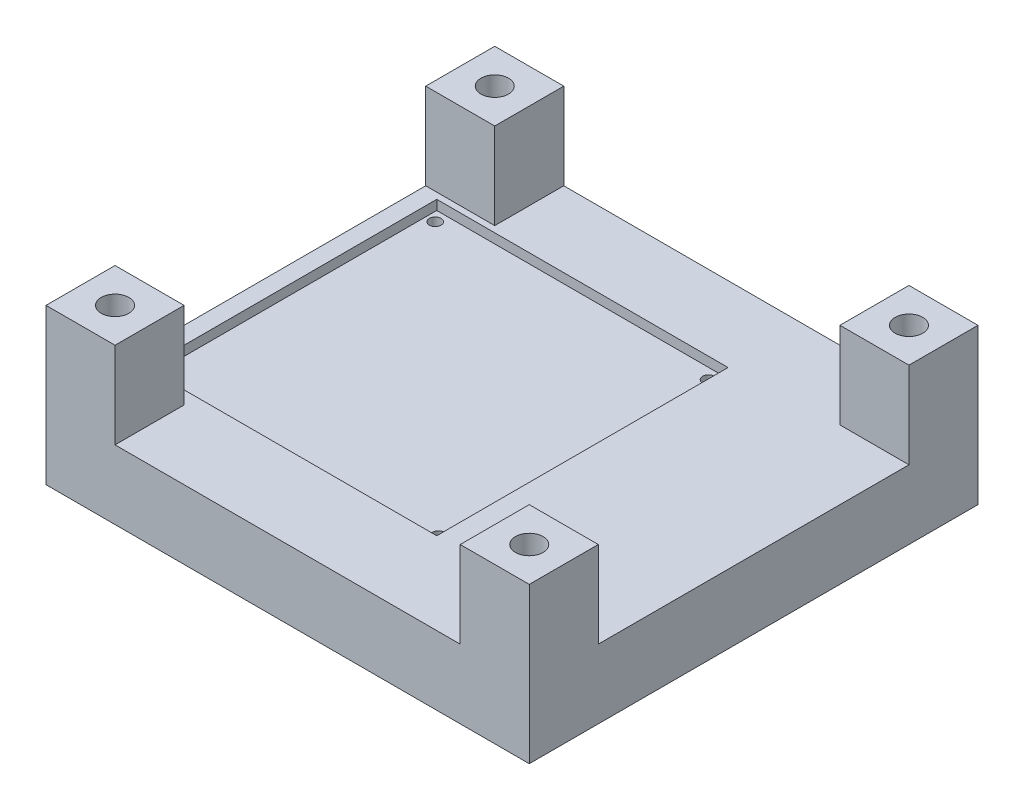
ISO-10303-21;
HEADER;
FILE_DESCRIPTION(('STEP AP214'),'2;1');
FILE_NAME('part.step','',(''),(''),'','','');
FILE_SCHEMA(('AUTOMOTIVE_DESIGN { 1 0 10303 214 1 1 1 1 }'));
ENDSEC;
DATA;
#1=APPLICATION_CONTEXT('core data for automotive mechanical design processes');
#2=APPLICATION_PROTOCOL_DEFINITION('international standard','automotive_design',2000,#1);
#3=PRODUCT_CONTEXT('',#1,'mechanical');
#4=PRODUCT('Part','Part','',(#3));
#5=PRODUCT_RELATED_PRODUCT_CATEGORY('part','',(#4));
#6=PRODUCT_DEFINITION_FORMATION('','',#4);
#7=PRODUCT_DEFINITION_CONTEXT('part definition',#1,'design');
#8=PRODUCT_DEFINITION('design','',#6,#7);
#9=PRODUCT_DEFINITION_SHAPE('','',#8);
#10=(LENGTH_UNIT() NAMED_UNIT(*) SI_UNIT(.MILLI.,.METRE.));
#11=(NAMED_UNIT(*) PLANE_ANGLE_UNIT() SI_UNIT($,.RADIAN.));
#12=(NAMED_UNIT(*) SI_UNIT($,.STERADIAN.) SOLID_ANGLE_UNIT());
#13=UNCERTAINTY_MEASURE_WITH_UNIT(LENGTH_MEASURE(1.E-05),#10,'distance_accuracy_value','');
#14=(GEOMETRIC_REPRESENTATION_CONTEXT(3) GLOBAL_UNCERTAINTY_ASSIGNED_CONTEXT((#13)) GLOBAL_UNIT_ASSIGNED_CONTEXT((#10,
#11,#12)) REPRESENTATION_CONTEXT('',''));
#15=CARTESIAN_POINT('',(0.,0.,0.));
#16=DIRECTION('',(0.,0.,1.));
#17=DIRECTION('',(1.,0.,0.));
#18=AXIS2_PLACEMENT_3D('',#15,#16,#17);
#19=CARTESIAN_POINT('',(0.,25.4,0.));
#20=DIRECTION('',(0.,1.,0.));
#21=DIRECTION('',(0.,0.,1.));
#22=AXIS2_PLACEMENT_3D('',#19,#20,#21);
#23=PLANE('',#22);
#24=DIRECTION('',(0.,0.,1.));
#25=VECTOR('',#24,1.);
#26=CARTESIAN_POINT('',(6.35,25.4,27.6829831364658));
#27=LINE('',#26,#25);
#28=CARTESIAN_POINT('',(6.35,25.4,27.6829831364658));
#29=VERTEX_POINT('',#28);
#30=CARTESIAN_POINT('',(6.35000000000001,25.4,134.870983136466));
#31=VERTEX_POINT('',#30);
#32=EDGE_CURVE('E54',#29,#31,#27,.T.);
#33=ORIENTED_EDGE('',*,*,#32,.F.);
#34=DIRECTION('',(-1.,0.,0.));
#35=VECTOR('',#34,1.);
#36=CARTESIAN_POINT('',(6.35,25.4,27.6829831364658));
#37=LINE('',#36,#35);
#38=CARTESIAN_POINT('',(113.538,25.4,27.6829831364658));
#39=VERTEX_POINT('',#38);
#40=EDGE_CURVE('E197',#39,#29,#37,.T.);
#41=ORIENTED_EDGE('',*,*,#40,.F.);
#42=DIRECTION('',(0.,0.,-1.));
#43=VECTOR('',#42,1.);
#44=CARTESIAN_POINT('',(113.538,25.4,27.6829831364658));
#45=LINE('',#44,#43);
#46=CARTESIAN_POINT('',(113.538,25.4,134.870983136466));
#47=VERTEX_POINT('',#46);
#48=EDGE_CURVE('E200',#47,#39,#45,.T.);
#49=ORIENTED_EDGE('',*,*,#48,.F.);
#50=DIRECTION('',(1.,0.,0.));
#51=VECTOR('',#50,1.);
#52=CARTESIAN_POINT('',(6.35000000000001,25.4,134.870983136466));
#53=LINE('',#52,#51);
#54=EDGE_CURVE('E209',#31,#47,#53,.T.);
#55=ORIENTED_EDGE('',*,*,#54,.F.);
#56=EDGE_LOOP('',(#33,#41,#49,#55));
#57=FACE_BOUND('',#56,.T.);
#58=DIRECTION('',(0.,0.,-1.));
#59=VECTOR('',#58,1.);
#60=CARTESIAN_POINT('',(152.4,25.4,0.));
#61=LINE('',#60,#59);
#62=CARTESIAN_POINT('',(152.4,25.4,25.4));
#63=VERTEX_POINT('',#62);
#64=CARTESIAN_POINT('',(152.4,25.4,0.));
#65=VERTEX_POINT('',#64);
#66=EDGE_CURVE('E216',#63,#65,#61,.T.);
#67=ORIENTED_EDGE('',*,*,#66,.T.);
#68=DIRECTION('',(-1.,0.,0.));
#69=VECTOR('',#68,1.);
#70=CARTESIAN_POINT('',(0.,25.4,0.));
#71=LINE('',#70,#69);
#72=CARTESIAN_POINT('',(25.4,25.4,0.));
#73=VERTEX_POINT('',#72);
#74=EDGE_CURVE('E325',#65,#73,#71,.T.);
#75=ORIENTED_EDGE('',*,*,#74,.T.);
#76=DIRECTION('',(0.,0.,-1.));
#77=VECTOR('',#76,1.);
#78=CARTESIAN_POINT('',(25.4,25.4,0.));
#79=LINE('',#78,#77);
#80=CARTESIAN_POINT('',(25.4,25.4,25.4));
#81=VERTEX_POINT('',#80);
#82=EDGE_CURVE('E297',#81,#73,#79,.T.);
#83=ORIENTED_EDGE('',*,*,#82,.F.);
#84=DIRECTION('',(1.,0.,0.));
#85=VECTOR('',#84,1.);
#86=CARTESIAN_POINT('',(0.,25.4,25.4));
#87=LINE('',#86,#85);
#88=CARTESIAN_POINT('',(0.,25.4,25.4));
#89=VERTEX_POINT('',#88);
#90=EDGE_CURVE('E292',#89,#81,#87,.T.);
#91=ORIENTED_EDGE('',*,*,#90,.F.);
#92=DIRECTION('',(0.,0.,1.));
#93=VECTOR('',#92,1.);
#94=CARTESIAN_POINT('',(0.,25.4,0.));
#95=LINE('',#94,#93);
#96=CARTESIAN_POINT('',(0.,25.4,139.7));
#97=VERTEX_POINT('',#96);
#98=EDGE_CURVE('E318',#89,#97,#95,.T.);
#99=ORIENTED_EDGE('',*,*,#98,.T.);
#100=DIRECTION('',(1.,0.,0.));
#101=VECTOR('',#100,1.);
#102=CARTESIAN_POINT('',(0.,25.4,139.7));
#103=LINE('',#102,#101);
#104=CARTESIAN_POINT('',(25.4,25.4,139.7));
#105=VERTEX_POINT('',#104);
#106=EDGE_CURVE('E272',#97,#105,#103,.T.);
#107=ORIENTED_EDGE('',*,*,#106,.T.);
#108=DIRECTION('',(0.,0.,1.));
#109=VECTOR('',#108,1.);
#110=CARTESIAN_POINT('',(25.4,25.4,165.1));
#111=LINE('',#110,#109);
#112=CARTESIAN_POINT('',(25.4,25.4,165.1));
#113=VERTEX_POINT('',#112);
#114=EDGE_CURVE('E267',#105,#113,#111,.T.);
#115=ORIENTED_EDGE('',*,*,#114,.T.);
#116=DIRECTION('',(1.,0.,0.));
#117=VECTOR('',#116,1.);
#118=CARTESIAN_POINT('',(0.,25.4,165.1));
#119=LINE('',#118,#117);
#120=CARTESIAN_POINT('',(152.4,25.4,165.1));
#121=VERTEX_POINT('',#120);
#122=EDGE_CURVE('E320',#113,#121,#119,.T.);
#123=ORIENTED_EDGE('',*,*,#122,.T.);
#124=DIRECTION('',(0.,0.,1.));
#125=VECTOR('',#124,1.);
#126=CARTESIAN_POINT('',(152.4,25.4,165.1));
#127=LINE('',#126,#125);
#128=CARTESIAN_POINT('',(152.4,25.4,139.7));
#129=VERTEX_POINT('',#128);
#130=EDGE_CURVE('E247',#129,#121,#127,.T.);
#131=ORIENTED_EDGE('',*,*,#130,.F.);
#132=DIRECTION('',(-1.,0.,0.));
#133=VECTOR('',#132,1.);
#134=CARTESIAN_POINT('',(177.8,25.4,139.7));
#135=LINE('',#134,#133);
#136=CARTESIAN_POINT('',(177.8,25.4,139.7));
#137=VERTEX_POINT('',#136);
#138=EDGE_CURVE('E242',#137,#129,#135,.T.);
#139=ORIENTED_EDGE('',*,*,#138,.F.);
#140=DIRECTION('',(0.,0.,-1.));
#141=VECTOR('',#140,1.);
#142=CARTESIAN_POINT('',(177.8,25.4,0.));
#143=LINE('',#142,#141);
#144=CARTESIAN_POINT('',(177.8,25.4,25.4));
#145=VERTEX_POINT('',#144);
#146=EDGE_CURVE('E323',#137,#145,#143,.T.);
#147=ORIENTED_EDGE('',*,*,#146,.T.);
#148=DIRECTION('',(-1.,0.,0.));
#149=VECTOR('',#148,1.);
#150=CARTESIAN_POINT('',(177.8,25.4,25.4));
#151=LINE('',#150,#149);
#152=EDGE_CURVE('E62',#145,#63,#151,.T.);
#153=ORIENTED_EDGE('',*,*,#152,.T.);
#154=EDGE_LOOP('',(#67,#75,#83,#91,#99,#107,#115,#123,#131,#139,#147,#153));
#155=FACE_BOUND('',#154,.T.);
#156=ADVANCED_FACE('F39',(#57,#155),#23,.T.);
#157=CARTESIAN_POINT('',(0.,25.4,0.));
#158=DIRECTION('',(1.,0.,0.));
#159=DIRECTION('',(0.,0.,-1.));
#160=AXIS2_PLACEMENT_3D('',#157,#158,#159);
#161=PLANE('',#160);
#162=DIRECTION('',(0.,0.,1.));
#163=VECTOR('',#162,1.);
#164=CARTESIAN_POINT('',(0.,0.,0.));
#165=LINE('',#164,#163);
#166=CARTESIAN_POINT('',(0.,0.,0.));
#167=VERTEX_POINT('',#166);
#168=CARTESIAN_POINT('',(0.,0.,165.1));
#169=VERTEX_POINT('',#168);
#170=EDGE_CURVE('E317',#167,#169,#165,.T.);
#171=ORIENTED_EDGE('',*,*,#170,.T.);
#172=DIRECTION('',(0.,-1.,0.));
#173=VECTOR('',#172,1.);
#174=CARTESIAN_POINT('',(0.,25.4,165.1));
#175=LINE('',#174,#173);
#176=CARTESIAN_POINT('',(0.,57.15,165.1));
#177=VERTEX_POINT('',#176);
#178=EDGE_CURVE('E11',#177,#169,#175,.T.);
#179=ORIENTED_EDGE('',*,*,#178,.F.);
#180=DIRECTION('',(0.,0.,-1.));
#181=VECTOR('',#180,1.);
#182=CARTESIAN_POINT('',(0.,57.15,165.1));
#183=LINE('',#182,#181);
#184=CARTESIAN_POINT('',(0.,57.15,139.7));
#185=VERTEX_POINT('',#184);
#186=EDGE_CURVE('E268',#177,#185,#183,.T.);
#187=ORIENTED_EDGE('',*,*,#186,.T.);
#188=DIRECTION('',(0.,-1.,0.));
#189=VECTOR('',#188,1.);
#190=CARTESIAN_POINT('',(0.,57.15,139.7));
#191=LINE('',#190,#189);
#192=EDGE_CURVE('E281',#185,#97,#191,.T.);
#193=ORIENTED_EDGE('',*,*,#192,.T.);
#194=ORIENTED_EDGE('',*,*,#98,.F.);
#195=DIRECTION('',(0.,-1.,0.));
#196=VECTOR('',#195,1.);
#197=CARTESIAN_POINT('',(0.,57.15,25.4));
#198=LINE('',#197,#196);
#199=CARTESIAN_POINT('',(0.,57.15,25.4));
#200=VERTEX_POINT('',#199);
#201=EDGE_CURVE('E314',#200,#89,#198,.T.);
#202=ORIENTED_EDGE('',*,*,#201,.F.);
#203=DIRECTION('',(0.,0.,1.));
#204=VECTOR('',#203,1.);
#205=CARTESIAN_POINT('',(0.,57.15,0.));
#206=LINE('',#205,#204);
#207=CARTESIAN_POINT('',(0.,57.15,0.));
#208=VERTEX_POINT('',#207);
#209=EDGE_CURVE('E293',#208,#200,#206,.T.);
#210=ORIENTED_EDGE('',*,*,#209,.F.);
#211=DIRECTION('',(0.,-1.,0.));
#212=VECTOR('',#211,1.);
#213=CARTESIAN_POINT('',(0.,25.4,0.));
#214=LINE('',#213,#212);
#215=EDGE_CURVE('E327',#208,#167,#214,.T.);
#216=ORIENTED_EDGE('',*,*,#215,.T.);
#217=EDGE_LOOP('',(#171,#179,#187,#193,#194,#202,#210,#216));
#218=FACE_BOUND('',#217,.T.);
#219=ADVANCED_FACE('F41',(#218),#161,.F.);
#220=CARTESIAN_POINT('',(0.,25.4,165.1));
#221=DIRECTION('',(0.,0.,-1.));
#222=DIRECTION('',(-1.,0.,0.));
#223=AXIS2_PLACEMENT_3D('',#220,#221,#222);
#224=PLANE('',#223);
#225=DIRECTION('',(1.,0.,0.));
#226=VECTOR('',#225,1.);
#227=CARTESIAN_POINT('',(0.,0.,165.1));
#228=LINE('',#227,#226);
#229=CARTESIAN_POINT('',(177.8,0.,165.1));
#230=VERTEX_POINT('',#229);
#231=EDGE_CURVE('E330',#169,#230,#228,.T.);
#232=ORIENTED_EDGE('',*,*,#231,.T.);
#233=DIRECTION('',(0.,-1.,0.));
#234=VECTOR('',#233,1.);
#235=CARTESIAN_POINT('',(177.8,25.4,165.1));
#236=LINE('',#235,#234);
#237=CARTESIAN_POINT('',(177.8,57.15,165.1));
#238=VERTEX_POINT('',#237);
#239=EDGE_CURVE('E47',#238,#230,#236,.T.);
#240=ORIENTED_EDGE('',*,*,#239,.F.);
#241=DIRECTION('',(1.,0.,0.));
#242=VECTOR('',#241,1.);
#243=CARTESIAN_POINT('',(177.8,57.15,165.1));
#244=LINE('',#243,#242);
#245=CARTESIAN_POINT('',(152.4,57.15,165.1));
#246=VERTEX_POINT('',#245);
#247=EDGE_CURVE('E251',#246,#238,#244,.T.);
#248=ORIENTED_EDGE('',*,*,#247,.F.);
#249=DIRECTION('',(0.,-1.,0.));
#250=VECTOR('',#249,1.);
#251=CARTESIAN_POINT('',(152.4,57.15,165.1));
#252=LINE('',#251,#250);
#253=EDGE_CURVE('E254',#246,#121,#252,.T.);
#254=ORIENTED_EDGE('',*,*,#253,.T.);
#255=ORIENTED_EDGE('',*,*,#122,.F.);
#256=DIRECTION('',(0.,-1.,0.));
#257=VECTOR('',#256,1.);
#258=CARTESIAN_POINT('',(25.4,57.15,165.1));
#259=LINE('',#258,#257);
#260=CARTESIAN_POINT('',(25.4,57.15,165.1));
#261=VERTEX_POINT('',#260);
#262=EDGE_CURVE('E289',#261,#113,#259,.T.);
#263=ORIENTED_EDGE('',*,*,#262,.F.);
#264=DIRECTION('',(-1.,0.,0.));
#265=VECTOR('',#264,1.);
#266=CARTESIAN_POINT('',(0.,57.15,165.1));
#267=LINE('',#266,#265);
#268=EDGE_CURVE('E271',#261,#177,#267,.T.);
#269=ORIENTED_EDGE('',*,*,#268,.T.);
#270=ORIENTED_EDGE('',*,*,#178,.T.);
#271=EDGE_LOOP('',(#232,#240,#248,#254,#255,#263,#269,#270));
#272=FACE_BOUND('',#271,.T.);
#273=ADVANCED_FACE('F383',(#272),#224,.F.);
#274=CARTESIAN_POINT('',(177.8,25.4,0.));
#275=DIRECTION('',(-1.,0.,0.));
#276=DIRECTION('',(0.,0.,1.));
#277=AXIS2_PLACEMENT_3D('',#274,#275,#276);
#278=PLANE('',#277);
#279=DIRECTION('',(0.,0.,-1.));
#280=VECTOR('',#279,1.);
#281=CARTESIAN_POINT('',(177.8,0.,0.));
#282=LINE('',#281,#280);
#283=CARTESIAN_POINT('',(177.8,0.,0.));
#284=VERTEX_POINT('',#283);
#285=EDGE_CURVE('E332',#230,#284,#282,.T.);
#286=ORIENTED_EDGE('',*,*,#285,.T.);
#287=DIRECTION('',(0.,-1.,0.));
#288=VECTOR('',#287,1.);
#289=CARTESIAN_POINT('',(177.8,25.4,0.));
#290=LINE('',#289,#288);
#291=CARTESIAN_POINT('',(177.8,57.15,0.));
#292=VERTEX_POINT('',#291);
#293=EDGE_CURVE('E337',#292,#284,#290,.T.);
#294=ORIENTED_EDGE('',*,*,#293,.F.);
#295=DIRECTION('',(0.,0.,1.));
#296=VECTOR('',#295,1.);
#297=CARTESIAN_POINT('',(177.8,57.15,0.));
#298=LINE('',#297,#296);
#299=CARTESIAN_POINT('',(177.8,57.15,25.4));
#300=VERTEX_POINT('',#299);
#301=EDGE_CURVE('E220',#292,#300,#298,.T.);
#302=ORIENTED_EDGE('',*,*,#301,.T.);
#303=DIRECTION('',(0.,-1.,0.));
#304=VECTOR('',#303,1.);
#305=CARTESIAN_POINT('',(177.8,57.15,25.4));
#306=LINE('',#305,#304);
#307=EDGE_CURVE('E232',#300,#145,#306,.T.);
#308=ORIENTED_EDGE('',*,*,#307,.T.);
#309=ORIENTED_EDGE('',*,*,#146,.F.);
#310=DIRECTION('',(0.,-1.,0.));
#311=VECTOR('',#310,1.);
#312=CARTESIAN_POINT('',(177.8,57.15,139.7));
#313=LINE('',#312,#311);
#314=CARTESIAN_POINT('',(177.8,57.15,139.7));
#315=VERTEX_POINT('',#314);
#316=EDGE_CURVE('E264',#315,#137,#313,.T.);
#317=ORIENTED_EDGE('',*,*,#316,.F.);
#318=DIRECTION('',(0.,0.,-1.));
#319=VECTOR('',#318,1.);
#320=CARTESIAN_POINT('',(177.8,57.15,165.1));
#321=LINE('',#320,#319);
#322=EDGE_CURVE('E243',#238,#315,#321,.T.);
#323=ORIENTED_EDGE('',*,*,#322,.F.);
#324=ORIENTED_EDGE('',*,*,#239,.T.);
#325=EDGE_LOOP('',(#286,#294,#302,#308,#309,#317,#323,#324));
#326=FACE_BOUND('',#325,.T.);
#327=ADVANCED_FACE('F343',(#326),#278,.F.);
#328=CARTESIAN_POINT('',(0.,25.4,0.));
#329=DIRECTION('',(0.,0.,1.));
#330=DIRECTION('',(1.,0.,0.));
#331=AXIS2_PLACEMENT_3D('',#328,#329,#330);
#332=PLANE('',#331);
#333=DIRECTION('',(-1.,0.,0.));
#334=VECTOR('',#333,1.);
#335=CARTESIAN_POINT('',(0.,0.,0.));
#336=LINE('',#335,#334);
#337=EDGE_CURVE('E321',#284,#167,#336,.T.);
#338=ORIENTED_EDGE('',*,*,#337,.T.);
#339=ORIENTED_EDGE('',*,*,#215,.F.);
#340=DIRECTION('',(-1.,0.,0.));
#341=VECTOR('',#340,1.);
#342=CARTESIAN_POINT('',(0.,57.15,0.));
#343=LINE('',#342,#341);
#344=CARTESIAN_POINT('',(25.4,57.15,0.));
#345=VERTEX_POINT('',#344);
#346=EDGE_CURVE('E301',#345,#208,#343,.T.);
#347=ORIENTED_EDGE('',*,*,#346,.F.);
#348=DIRECTION('',(0.,-1.,0.));
#349=VECTOR('',#348,1.);
#350=CARTESIAN_POINT('',(25.4,57.15,0.));
#351=LINE('',#350,#349);
#352=EDGE_CURVE('E304',#345,#73,#351,.T.);
#353=ORIENTED_EDGE('',*,*,#352,.T.);
#354=ORIENTED_EDGE('',*,*,#74,.F.);
#355=DIRECTION('',(0.,-1.,0.));
#356=VECTOR('',#355,1.);
#357=CARTESIAN_POINT('',(152.4,57.15,0.));
#358=LINE('',#357,#356);
#359=CARTESIAN_POINT('',(152.4,57.15,0.));
#360=VERTEX_POINT('',#359);
#361=EDGE_CURVE('E239',#360,#65,#358,.T.);
#362=ORIENTED_EDGE('',*,*,#361,.F.);
#363=DIRECTION('',(1.,0.,0.));
#364=VECTOR('',#363,1.);
#365=CARTESIAN_POINT('',(177.8,57.15,0.));
#366=LINE('',#365,#364);
#367=EDGE_CURVE('E223',#360,#292,#366,.T.);
#368=ORIENTED_EDGE('',*,*,#367,.T.);
#369=ORIENTED_EDGE('',*,*,#293,.T.);
#370=EDGE_LOOP('',(#338,#339,#347,#353,#354,#362,#368,#369));
#371=FACE_BOUND('',#370,.T.);
#372=ADVANCED_FACE('F352',(#371),#332,.F.);
#373=CARTESIAN_POINT('',(0.,0.,0.));
#374=DIRECTION('',(0.,1.,0.));
#375=DIRECTION('',(0.,0.,1.));
#376=AXIS2_PLACEMENT_3D('',#373,#374,#375);
#377=PLANE('',#376);
#378=ORIENTED_EDGE('',*,*,#170,.F.);
#379=ORIENTED_EDGE('',*,*,#337,.F.);
#380=ORIENTED_EDGE('',*,*,#285,.F.);
#381=ORIENTED_EDGE('',*,*,#231,.F.);
#382=EDGE_LOOP('',(#378,#379,#380,#381));
#383=FACE_BOUND('',#382,.T.);
#384=ADVANCED_FACE('F350',(#383),#377,.F.);
#385=CARTESIAN_POINT('',(0.,57.15,25.4));
#386=DIRECTION('',(0.,0.,-1.));
#387=DIRECTION('',(-1.,0.,0.));
#388=AXIS2_PLACEMENT_3D('',#385,#386,#387);
#389=PLANE('',#388);
#390=ORIENTED_EDGE('',*,*,#90,.T.);
#391=DIRECTION('',(0.,-1.,0.));
#392=VECTOR('',#391,1.);
#393=CARTESIAN_POINT('',(25.4,57.15,25.4));
#394=LINE('',#393,#392);
#395=CARTESIAN_POINT('',(25.4,57.15,25.4));
#396=VERTEX_POINT('',#395);
#397=EDGE_CURVE('E311',#396,#81,#394,.T.);
#398=ORIENTED_EDGE('',*,*,#397,.F.);
#399=DIRECTION('',(1.,0.,0.));
#400=VECTOR('',#399,1.);
#401=CARTESIAN_POINT('',(0.,57.15,25.4));
#402=LINE('',#401,#400);
#403=EDGE_CURVE('E296',#200,#396,#402,.T.);
#404=ORIENTED_EDGE('',*,*,#403,.F.);
#405=ORIENTED_EDGE('',*,*,#201,.T.);
#406=EDGE_LOOP('',(#390,#398,#404,#405));
#407=FACE_BOUND('',#406,.T.);
#408=ADVANCED_FACE('F366',(#407),#389,.F.);
#409=CARTESIAN_POINT('',(25.4,57.15,0.));
#410=DIRECTION('',(-1.,0.,0.));
#411=DIRECTION('',(0.,0.,1.));
#412=AXIS2_PLACEMENT_3D('',#409,#410,#411);
#413=PLANE('',#412);
#414=ORIENTED_EDGE('',*,*,#82,.T.);
#415=ORIENTED_EDGE('',*,*,#352,.F.);
#416=DIRECTION('',(0.,0.,-1.));
#417=VECTOR('',#416,1.);
#418=CARTESIAN_POINT('',(25.4,57.15,0.));
#419=LINE('',#418,#417);
#420=EDGE_CURVE('E299',#396,#345,#419,.T.);
#421=ORIENTED_EDGE('',*,*,#420,.F.);
#422=ORIENTED_EDGE('',*,*,#397,.T.);
#423=EDGE_LOOP('',(#414,#415,#421,#422));
#424=FACE_BOUND('',#423,.T.);
#425=ADVANCED_FACE('F364',(#424),#413,.F.);
#426=CARTESIAN_POINT('',(0.,57.15,0.));
#427=DIRECTION('',(0.,1.,0.));
#428=DIRECTION('',(0.,0.,1.));
#429=AXIS2_PLACEMENT_3D('',#426,#427,#428);
#430=PLANE('',#429);
#431=CARTESIAN_POINT('',(12.7,57.15,12.7));
#432=DIRECTION('',(0.,1.,0.));
#433=DIRECTION('',(0.,0.,1.));
#434=AXIS2_PLACEMENT_3D('',#431,#432,#433);
#435=CIRCLE('',#434,5.08);
#436=CARTESIAN_POINT('',(12.7,57.15,17.78));
#437=VERTEX_POINT('',#436);
#438=EDGE_CURVE('E499',#437,#437,#435,.T.);
#439=ORIENTED_EDGE('',*,*,#438,.F.);
#440=EDGE_LOOP('',(#439));
#441=FACE_BOUND('',#440,.T.);
#442=ORIENTED_EDGE('',*,*,#209,.T.);
#443=ORIENTED_EDGE('',*,*,#403,.T.);
#444=ORIENTED_EDGE('',*,*,#420,.T.);
#445=ORIENTED_EDGE('',*,*,#346,.T.);
#446=EDGE_LOOP('',(#442,#443,#444,#445));
#447=FACE_BOUND('',#446,.T.);
#448=ADVANCED_FACE('F359',(#441,#447),#430,.T.);
#449=CARTESIAN_POINT('',(25.4,57.15,165.1));
#450=DIRECTION('',(1.,0.,0.));
#451=DIRECTION('',(0.,0.,-1.));
#452=AXIS2_PLACEMENT_3D('',#449,#450,#451);
#453=PLANE('',#452);
#454=ORIENTED_EDGE('',*,*,#114,.F.);
#455=DIRECTION('',(0.,-1.,0.));
#456=VECTOR('',#455,1.);
#457=CARTESIAN_POINT('',(25.4,57.15,139.7));
#458=LINE('',#457,#456);
#459=CARTESIAN_POINT('',(25.4,57.15,139.7));
#460=VERTEX_POINT('',#459);
#461=EDGE_CURVE('E286',#460,#105,#458,.T.);
#462=ORIENTED_EDGE('',*,*,#461,.F.);
#463=DIRECTION('',(0.,0.,1.));
#464=VECTOR('',#463,1.);
#465=CARTESIAN_POINT('',(25.4,57.15,165.1));
#466=LINE('',#465,#464);
#467=EDGE_CURVE('E275',#460,#261,#466,.T.);
#468=ORIENTED_EDGE('',*,*,#467,.T.);
#469=ORIENTED_EDGE('',*,*,#262,.T.);
#470=EDGE_LOOP('',(#454,#462,#468,#469));
#471=FACE_BOUND('',#470,.T.);
#472=ADVANCED_FACE('F405',(#471),#453,.T.);
#473=CARTESIAN_POINT('',(0.,57.15,139.7));
#474=DIRECTION('',(0.,0.,-1.));
#475=DIRECTION('',(-1.,0.,0.));
#476=AXIS2_PLACEMENT_3D('',#473,#474,#475);
#477=PLANE('',#476);
#478=ORIENTED_EDGE('',*,*,#106,.F.);
#479=ORIENTED_EDGE('',*,*,#192,.F.);
#480=DIRECTION('',(1.,0.,0.));
#481=VECTOR('',#480,1.);
#482=CARTESIAN_POINT('',(0.,57.15,139.7));
#483=LINE('',#482,#481);
#484=EDGE_CURVE('E278',#185,#460,#483,.T.);
#485=ORIENTED_EDGE('',*,*,#484,.T.);
#486=ORIENTED_EDGE('',*,*,#461,.T.);
#487=EDGE_LOOP('',(#478,#479,#485,#486));
#488=FACE_BOUND('',#487,.T.);
#489=ADVANCED_FACE('F400',(#488),#477,.T.);
#490=CARTESIAN_POINT('',(0.,57.15,165.1));
#491=DIRECTION('',(0.,1.,0.));
#492=DIRECTION('',(0.,0.,-1.));
#493=AXIS2_PLACEMENT_3D('',#490,#491,#492);
#494=PLANE('',#493);
#495=CARTESIAN_POINT('',(12.7,57.15,152.4));
#496=DIRECTION('',(0.,-1.,0.));
#497=DIRECTION('',(0.,0.,-1.));
#498=AXIS2_PLACEMENT_3D('',#495,#496,#497);
#499=CIRCLE('',#498,5.08);
#500=CARTESIAN_POINT('',(12.7,57.15,147.32));
#501=VERTEX_POINT('',#500);
#502=EDGE_CURVE('E546',#501,#501,#499,.T.);
#503=ORIENTED_EDGE('',*,*,#502,.T.);
#504=EDGE_LOOP('',(#503));
#505=FACE_BOUND('',#504,.T.);
#506=ORIENTED_EDGE('',*,*,#186,.F.);
#507=ORIENTED_EDGE('',*,*,#268,.F.);
#508=ORIENTED_EDGE('',*,*,#467,.F.);
#509=ORIENTED_EDGE('',*,*,#484,.F.);
#510=EDGE_LOOP('',(#506,#507,#508,#509));
#511=FACE_BOUND('',#510,.T.);
#512=ADVANCED_FACE('F396',(#505,#511),#494,.T.);
#513=CARTESIAN_POINT('',(177.8,57.15,139.7));
#514=DIRECTION('',(0.,0.,1.));
#515=DIRECTION('',(1.,0.,0.));
#516=AXIS2_PLACEMENT_3D('',#513,#514,#515);
#517=PLANE('',#516);
#518=ORIENTED_EDGE('',*,*,#138,.T.);
#519=DIRECTION('',(0.,-1.,0.));
#520=VECTOR('',#519,1.);
#521=CARTESIAN_POINT('',(152.4,57.15,139.7));
#522=LINE('',#521,#520);
#523=CARTESIAN_POINT('',(152.4,57.15,139.7));
#524=VERTEX_POINT('',#523);
#525=EDGE_CURVE('E261',#524,#129,#522,.T.);
#526=ORIENTED_EDGE('',*,*,#525,.F.);
#527=DIRECTION('',(-1.,0.,0.));
#528=VECTOR('',#527,1.);
#529=CARTESIAN_POINT('',(177.8,57.15,139.7));
#530=LINE('',#529,#528);
#531=EDGE_CURVE('E246',#315,#524,#530,.T.);
#532=ORIENTED_EDGE('',*,*,#531,.F.);
#533=ORIENTED_EDGE('',*,*,#316,.T.);
#534=EDGE_LOOP('',(#518,#526,#532,#533));
#535=FACE_BOUND('',#534,.T.);
#536=ADVANCED_FACE('F417',(#535),#517,.F.);
#537=CARTESIAN_POINT('',(152.4,57.15,165.1));
#538=DIRECTION('',(1.,0.,0.));
#539=DIRECTION('',(0.,0.,-1.));
#540=AXIS2_PLACEMENT_3D('',#537,#538,#539);
#541=PLANE('',#540);
#542=ORIENTED_EDGE('',*,*,#130,.T.);
#543=ORIENTED_EDGE('',*,*,#253,.F.);
#544=DIRECTION('',(0.,0.,1.));
#545=VECTOR('',#544,1.);
#546=CARTESIAN_POINT('',(152.4,57.15,165.1));
#547=LINE('',#546,#545);
#548=EDGE_CURVE('E249',#524,#246,#547,.T.);
#549=ORIENTED_EDGE('',*,*,#548,.F.);
#550=ORIENTED_EDGE('',*,*,#525,.T.);
#551=EDGE_LOOP('',(#542,#543,#549,#550));
#552=FACE_BOUND('',#551,.T.);
#553=ADVANCED_FACE('F421',(#552),#541,.F.);
#554=CARTESIAN_POINT('',(177.8,57.15,165.1));
#555=DIRECTION('',(0.,1.,0.));
#556=DIRECTION('',(0.,0.,-1.));
#557=AXIS2_PLACEMENT_3D('',#554,#555,#556);
#558=PLANE('',#557);
#559=CARTESIAN_POINT('',(165.1,57.15,152.4));
#560=DIRECTION('',(0.,1.,0.));
#561=DIRECTION('',(0.,0.,-1.));
#562=AXIS2_PLACEMENT_3D('',#559,#560,#561);
#563=CIRCLE('',#562,5.08);
#564=CARTESIAN_POINT('',(165.1,57.15,147.32));
#565=VERTEX_POINT('',#564);
#566=EDGE_CURVE('E545',#565,#565,#563,.T.);
#567=ORIENTED_EDGE('',*,*,#566,.F.);
#568=EDGE_LOOP('',(#567));
#569=FACE_BOUND('',#568,.T.);
#570=ORIENTED_EDGE('',*,*,#322,.T.);
#571=ORIENTED_EDGE('',*,*,#531,.T.);
#572=ORIENTED_EDGE('',*,*,#548,.T.);
#573=ORIENTED_EDGE('',*,*,#247,.T.);
#574=EDGE_LOOP('',(#570,#571,#572,#573));
#575=FACE_BOUND('',#574,.T.);
#576=ADVANCED_FACE('F425',(#569,#575),#558,.T.);
#577=CARTESIAN_POINT('',(152.4,57.15,0.));
#578=DIRECTION('',(-1.,0.,0.));
#579=DIRECTION('',(0.,0.,1.));
#580=AXIS2_PLACEMENT_3D('',#577,#578,#579);
#581=PLANE('',#580);
#582=ORIENTED_EDGE('',*,*,#66,.F.);
#583=DIRECTION('',(0.,-1.,0.));
#584=VECTOR('',#583,1.);
#585=CARTESIAN_POINT('',(152.4,57.15,25.4));
#586=LINE('',#585,#584);
#587=CARTESIAN_POINT('',(152.4,57.15,25.4));
#588=VERTEX_POINT('',#587);
#589=EDGE_CURVE('E237',#588,#63,#586,.T.);
#590=ORIENTED_EDGE('',*,*,#589,.F.);
#591=DIRECTION('',(0.,0.,-1.));
#592=VECTOR('',#591,1.);
#593=CARTESIAN_POINT('',(152.4,57.15,0.));
#594=LINE('',#593,#592);
#595=EDGE_CURVE('E226',#588,#360,#594,.T.);
#596=ORIENTED_EDGE('',*,*,#595,.T.);
#597=ORIENTED_EDGE('',*,*,#361,.T.);
#598=EDGE_LOOP('',(#582,#590,#596,#597));
#599=FACE_BOUND('',#598,.T.);
#600=ADVANCED_FACE('F429',(#599),#581,.T.);
#601=CARTESIAN_POINT('',(177.8,57.15,25.4));
#602=DIRECTION('',(0.,0.,1.));
#603=DIRECTION('',(1.,0.,0.));
#604=AXIS2_PLACEMENT_3D('',#601,#602,#603);
#605=PLANE('',#604);
#606=ORIENTED_EDGE('',*,*,#152,.F.);
#607=ORIENTED_EDGE('',*,*,#307,.F.);
#608=DIRECTION('',(-1.,0.,0.));
#609=VECTOR('',#608,1.);
#610=CARTESIAN_POINT('',(177.8,57.15,25.4));
#611=LINE('',#610,#609);
#612=EDGE_CURVE('E229',#300,#588,#611,.T.);
#613=ORIENTED_EDGE('',*,*,#612,.T.);
#614=ORIENTED_EDGE('',*,*,#589,.T.);
#615=EDGE_LOOP('',(#606,#607,#613,#614));
#616=FACE_BOUND('',#615,.T.);
#617=ADVANCED_FACE('F433',(#616),#605,.T.);
#618=CARTESIAN_POINT('',(177.8,57.15,0.));
#619=DIRECTION('',(0.,1.,0.));
#620=DIRECTION('',(0.,0.,1.));
#621=AXIS2_PLACEMENT_3D('',#618,#619,#620);
#622=PLANE('',#621);
#623=CARTESIAN_POINT('',(165.1,57.15,12.7));
#624=DIRECTION('',(0.,-1.,0.));
#625=DIRECTION('',(0.,0.,1.));
#626=AXIS2_PLACEMENT_3D('',#623,#624,#625);
#627=CIRCLE('',#626,5.08);
#628=CARTESIAN_POINT('',(165.1,57.15,17.78));
#629=VERTEX_POINT('',#628);
#630=EDGE_CURVE('E555',#629,#629,#627,.T.);
#631=ORIENTED_EDGE('',*,*,#630,.T.);
#632=EDGE_LOOP('',(#631));
#633=FACE_BOUND('',#632,.T.);
#634=ORIENTED_EDGE('',*,*,#301,.F.);
#635=ORIENTED_EDGE('',*,*,#367,.F.);
#636=ORIENTED_EDGE('',*,*,#595,.F.);
#637=ORIENTED_EDGE('',*,*,#612,.F.);
#638=EDGE_LOOP('',(#634,#635,#636,#637));
#639=FACE_BOUND('',#638,.T.);
#640=ADVANCED_FACE('F436',(#633,#639),#622,.T.);
#641=CARTESIAN_POINT('',(6.35,21.844,27.6829831364658));
#642=DIRECTION('',(-1.,0.,0.));
#643=DIRECTION('',(0.,0.,1.));
#644=AXIS2_PLACEMENT_3D('',#641,#642,#643);
#645=PLANE('',#644);
#646=ORIENTED_EDGE('',*,*,#32,.T.);
#647=DIRECTION('',(0.,1.,0.));
#648=VECTOR('',#647,1.);
#649=CARTESIAN_POINT('',(6.35000000000001,21.844,134.870983136466));
#650=LINE('',#649,#648);
#651=CARTESIAN_POINT('',(6.35000000000001,21.844,134.870983136466));
#652=VERTEX_POINT('',#651);
#653=EDGE_CURVE('E175',#652,#31,#650,.T.);
#654=ORIENTED_EDGE('',*,*,#653,.F.);
#655=DIRECTION('',(0.,0.,1.));
#656=VECTOR('',#655,1.);
#657=CARTESIAN_POINT('',(6.35,21.844,27.6829831364658));
#658=LINE('',#657,#656);
#659=CARTESIAN_POINT('',(6.35,21.844,27.6829831364658));
#660=VERTEX_POINT('',#659);
#661=EDGE_CURVE('E179',#660,#652,#658,.T.);
#662=ORIENTED_EDGE('',*,*,#661,.F.);
#663=DIRECTION('',(0.,1.,0.));
#664=VECTOR('',#663,1.);
#665=CARTESIAN_POINT('',(6.35,21.844,27.6829831364658));
#666=LINE('',#665,#664);
#667=EDGE_CURVE('E214',#660,#29,#666,.T.);
#668=ORIENTED_EDGE('',*,*,#667,.T.);
#669=EDGE_LOOP('',(#646,#654,#662,#668));
#670=FACE_BOUND('',#669,.T.);
#671=ADVANCED_FACE('F177',(#670),#645,.F.);
#672=CARTESIAN_POINT('',(6.35,21.844,27.6829831364658));
#673=DIRECTION('',(0.,0.,-1.));
#674=DIRECTION('',(-1.,0.,0.));
#675=AXIS2_PLACEMENT_3D('',#672,#673,#674);
#676=PLANE('',#675);
#677=ORIENTED_EDGE('',*,*,#40,.T.);
#678=ORIENTED_EDGE('',*,*,#667,.F.);
#679=DIRECTION('',(-1.,0.,0.));
#680=VECTOR('',#679,1.);
#681=CARTESIAN_POINT('',(6.35,21.844,27.6829831364658));
#682=LINE('',#681,#680);
#683=CARTESIAN_POINT('',(113.538,21.844,27.6829831364658));
#684=VERTEX_POINT('',#683);
#685=EDGE_CURVE('E185',#684,#660,#682,.T.);
#686=ORIENTED_EDGE('',*,*,#685,.F.);
#687=DIRECTION('',(0.,1.,0.));
#688=VECTOR('',#687,1.);
#689=CARTESIAN_POINT('',(113.538,21.844,27.6829831364658));
#690=LINE('',#689,#688);
#691=EDGE_CURVE('E217',#684,#39,#690,.T.);
#692=ORIENTED_EDGE('',*,*,#691,.T.);
#693=EDGE_LOOP('',(#677,#678,#686,#692));
#694=FACE_BOUND('',#693,.T.);
#695=ADVANCED_FACE('F442',(#694),#676,.F.);
#696=CARTESIAN_POINT('',(113.538,21.844,27.6829831364658));
#697=DIRECTION('',(1.,0.,0.));
#698=DIRECTION('',(0.,0.,-1.));
#699=AXIS2_PLACEMENT_3D('',#696,#697,#698);
#700=PLANE('',#699);
#701=ORIENTED_EDGE('',*,*,#48,.T.);
#702=ORIENTED_EDGE('',*,*,#691,.F.);
#703=DIRECTION('',(0.,0.,-1.));
#704=VECTOR('',#703,1.);
#705=CARTESIAN_POINT('',(113.538,21.844,27.6829831364658));
#706=LINE('',#705,#704);
#707=CARTESIAN_POINT('',(113.538,21.844,134.870983136466));
#708=VERTEX_POINT('',#707);
#709=EDGE_CURVE('E193',#708,#684,#706,.T.);
#710=ORIENTED_EDGE('',*,*,#709,.F.);
#711=DIRECTION('',(0.,1.,0.));
#712=VECTOR('',#711,1.);
#713=CARTESIAN_POINT('',(113.538,21.844,134.870983136466));
#714=LINE('',#713,#712);
#715=EDGE_CURVE('E184',#708,#47,#714,.T.);
#716=ORIENTED_EDGE('',*,*,#715,.T.);
#717=EDGE_LOOP('',(#701,#702,#710,#716));
#718=FACE_BOUND('',#717,.T.);
#719=ADVANCED_FACE('F445',(#718),#700,.F.);
#720=CARTESIAN_POINT('',(6.35000000000001,21.844,134.870983136466));
#721=DIRECTION('',(0.,0.,1.));
#722=DIRECTION('',(1.,0.,0.));
#723=AXIS2_PLACEMENT_3D('',#720,#721,#722);
#724=PLANE('',#723);
#725=ORIENTED_EDGE('',*,*,#54,.T.);
#726=ORIENTED_EDGE('',*,*,#715,.F.);
#727=DIRECTION('',(1.,0.,0.));
#728=VECTOR('',#727,1.);
#729=CARTESIAN_POINT('',(6.35000000000001,21.844,134.870983136466));
#730=LINE('',#729,#728);
#731=EDGE_CURVE('E188',#652,#708,#730,.T.);
#732=ORIENTED_EDGE('',*,*,#731,.F.);
#733=ORIENTED_EDGE('',*,*,#653,.T.);
#734=EDGE_LOOP('',(#725,#726,#732,#733));
#735=FACE_BOUND('',#734,.T.);
#736=ADVANCED_FACE('F189',(#735),#724,.F.);
#737=CARTESIAN_POINT('',(0.,21.844,0.));
#738=DIRECTION('',(0.,1.,0.));
#739=DIRECTION('',(0.,0.,1.));
#740=AXIS2_PLACEMENT_3D('',#737,#738,#739);
#741=PLANE('',#740);
#742=CARTESIAN_POINT('',(110.225048711912,21.844,31.5739358088142));
#743=DIRECTION('',(0.,-1.,0.));
#744=DIRECTION('',(0.831819226043434,0.,-0.555046642350444));
#745=AXIS2_PLACEMENT_3D('',#742,#743,#744);
#746=ELLIPSE('',#745,2.159,2.159);
#747=CARTESIAN_POINT('',(112.020946420939,21.844,30.3755901079796));
#748=VERTEX_POINT('',#747);
#749=EDGE_CURVE('E491',#748,#748,#746,.T.);
#750=ORIENTED_EDGE('',*,*,#749,.T.);
#751=EDGE_LOOP('',(#750));
#752=FACE_BOUND('',#751,.T.);
#753=CARTESIAN_POINT('',(110.225048711912,21.844,130.980030464117));
#754=DIRECTION('',(0.,1.,0.));
#755=DIRECTION('',(0.831819226043435,0.,0.555046642350444));
#756=AXIS2_PLACEMENT_3D('',#753,#754,#755);
#757=ELLIPSE('',#756,2.159,2.159);
#758=CARTESIAN_POINT('',(112.020946420939,21.844,132.178376164952));
#759=VERTEX_POINT('',#758);
#760=EDGE_CURVE('E472',#759,#759,#757,.T.);
#761=ORIENTED_EDGE('',*,*,#760,.F.);
#762=EDGE_LOOP('',(#761));
#763=FACE_BOUND('',#762,.T.);
#764=CARTESIAN_POINT('',(9.66295128808848,21.844,130.980030464117));
#765=DIRECTION('',(0.,-1.,0.));
#766=DIRECTION('',(-0.831819226043434,0.,0.555046642350444));
#767=AXIS2_PLACEMENT_3D('',#764,#765,#766);
#768=ELLIPSE('',#767,2.159,2.159);
#769=CARTESIAN_POINT('',(7.86705357906071,21.844,132.178376164952));
#770=VERTEX_POINT('',#769);
#771=EDGE_CURVE('E464',#770,#770,#768,.T.);
#772=ORIENTED_EDGE('',*,*,#771,.T.);
#773=EDGE_LOOP('',(#772));
#774=FACE_BOUND('',#773,.T.);
#775=CARTESIAN_POINT('',(9.66295128808848,21.844,31.5739358088142));
#776=DIRECTION('',(0.,1.,0.));
#777=DIRECTION('',(-0.831819226043434,0.,-0.555046642350444));
#778=AXIS2_PLACEMENT_3D('',#775,#776,#777);
#779=ELLIPSE('',#778,2.159,2.159);
#780=CARTESIAN_POINT('',(7.86705357906071,21.844,30.3755901079796));
#781=VERTEX_POINT('',#780);
#782=EDGE_CURVE('E203',#781,#781,#779,.T.);
#783=ORIENTED_EDGE('',*,*,#782,.F.);
#784=EDGE_LOOP('',(#783));
#785=FACE_BOUND('',#784,.T.);
#786=ORIENTED_EDGE('',*,*,#661,.T.);
#787=ORIENTED_EDGE('',*,*,#731,.T.);
#788=ORIENTED_EDGE('',*,*,#709,.T.);
#789=ORIENTED_EDGE('',*,*,#685,.T.);
#790=EDGE_LOOP('',(#786,#787,#788,#789));
#791=FACE_BOUND('',#790,.T.);
#792=ADVANCED_FACE('F195',(#752,#763,#774,#785,#791),#741,.T.);
#793=CARTESIAN_POINT('',(9.66295128808848,1.524,31.5739358088142));
#794=DIRECTION('',(0.,1.,0.));
#795=DIRECTION('',(-0.831819226043434,0.,-0.555046642350444));
#796=AXIS2_PLACEMENT_3D('',#793,#794,#795);
#797=ELLIPSE('',#796,2.159,2.159);
#798=DIRECTION('',(0.,1.,0.));
#799=VECTOR('',#798,1.);
#800=SURFACE_OF_LINEAR_EXTRUSION('',#797,#799);
#801=CARTESIAN_POINT('',(7.86705357906071,1.524,30.3755901079796));
#802=VERTEX_POINT('',#801);
#803=EDGE_CURVE('E210',#802,#802,#797,.T.);
#804=ORIENTED_EDGE('',*,*,#803,.F.);
#805=EDGE_LOOP('',(#804));
#806=FACE_BOUND('',#805,.T.);
#807=ORIENTED_EDGE('',*,*,#782,.T.);
#808=EDGE_LOOP('',(#807));
#809=FACE_BOUND('',#808,.T.);
#810=ADVANCED_FACE('F454',(#806,#809),#800,.F.);
#811=CARTESIAN_POINT('',(9.66295128808848,1.524,31.5739358088142));
#812=DIRECTION('',(0.,1.,0.));
#813=DIRECTION('',(0.,0.,1.));
#814=AXIS2_PLACEMENT_3D('',#811,#812,#813);
#815=PLANE('',#814);
#816=ORIENTED_EDGE('',*,*,#803,.T.);
#817=EDGE_LOOP('',(#816));
#818=FACE_BOUND('',#817,.T.);
#819=ADVANCED_FACE('F458',(#818),#815,.T.);
#820=CARTESIAN_POINT('',(9.66295128808848,1.524,130.980030464117));
#821=DIRECTION('',(0.,-1.,0.));
#822=DIRECTION('',(-0.831819226043434,0.,0.555046642350444));
#823=AXIS2_PLACEMENT_3D('',#820,#821,#822);
#824=ELLIPSE('',#823,2.159,2.159);
#825=DIRECTION('',(0.,1.,0.));
#826=VECTOR('',#825,1.);
#827=SURFACE_OF_LINEAR_EXTRUSION('',#824,#826);
#828=CARTESIAN_POINT('',(7.86705357906071,1.524,132.178376164952));
#829=VERTEX_POINT('',#828);
#830=EDGE_CURVE('E467',#829,#829,#824,.T.);
#831=ORIENTED_EDGE('',*,*,#830,.T.);
#832=EDGE_LOOP('',(#831));
#833=FACE_BOUND('',#832,.T.);
#834=ORIENTED_EDGE('',*,*,#771,.F.);
#835=EDGE_LOOP('',(#834));
#836=FACE_BOUND('',#835,.T.);
#837=ADVANCED_FACE('F474',(#833,#836),#827,.T.);
#838=CARTESIAN_POINT('',(9.66295128808848,1.524,130.980030464117));
#839=DIRECTION('',(0.,1.,0.));
#840=DIRECTION('',(0.,0.,-1.));
#841=AXIS2_PLACEMENT_3D('',#838,#839,#840);
#842=PLANE('',#841);
#843=ORIENTED_EDGE('',*,*,#830,.F.);
#844=EDGE_LOOP('',(#843));
#845=FACE_BOUND('',#844,.T.);
#846=ADVANCED_FACE('F477',(#845),#842,.T.);
#847=CARTESIAN_POINT('',(110.225048711912,1.524,130.980030464117));
#848=DIRECTION('',(0.,1.,0.));
#849=DIRECTION('',(0.831819226043435,0.,0.555046642350444));
#850=AXIS2_PLACEMENT_3D('',#847,#848,#849);
#851=ELLIPSE('',#850,2.159,2.159);
#852=DIRECTION('',(0.,1.,0.));
#853=VECTOR('',#852,1.);
#854=SURFACE_OF_LINEAR_EXTRUSION('',#851,#853);
#855=CARTESIAN_POINT('',(112.020946420939,1.524,132.178376164952));
#856=VERTEX_POINT('',#855);
#857=EDGE_CURVE('E468',#856,#856,#851,.T.);
#858=ORIENTED_EDGE('',*,*,#857,.F.);
#859=EDGE_LOOP('',(#858));
#860=FACE_BOUND('',#859,.T.);
#861=ORIENTED_EDGE('',*,*,#760,.T.);
#862=EDGE_LOOP('',(#861));
#863=FACE_BOUND('',#862,.T.);
#864=ADVANCED_FACE('F481',(#860,#863),#854,.F.);
#865=CARTESIAN_POINT('',(110.225048711912,1.524,130.980030464117));
#866=DIRECTION('',(0.,1.,0.));
#867=DIRECTION('',(0.,0.,-1.));
#868=AXIS2_PLACEMENT_3D('',#865,#866,#867);
#869=PLANE('',#868);
#870=ORIENTED_EDGE('',*,*,#857,.T.);
#871=EDGE_LOOP('',(#870));
#872=FACE_BOUND('',#871,.T.);
#873=ADVANCED_FACE('F485',(#872),#869,.T.);
#874=CARTESIAN_POINT('',(110.225048711912,1.524,31.5739358088142));
#875=DIRECTION('',(0.,-1.,0.));
#876=DIRECTION('',(0.831819226043434,0.,-0.555046642350444));
#877=AXIS2_PLACEMENT_3D('',#874,#875,#876);
#878=ELLIPSE('',#877,2.159,2.159);
#879=DIRECTION('',(0.,1.,0.));
#880=VECTOR('',#879,1.);
#881=SURFACE_OF_LINEAR_EXTRUSION('',#878,#880);
#882=CARTESIAN_POINT('',(112.020946420939,1.524,30.3755901079796));
#883=VERTEX_POINT('',#882);
#884=EDGE_CURVE('E494',#883,#883,#878,.T.);
#885=ORIENTED_EDGE('',*,*,#884,.T.);
#886=EDGE_LOOP('',(#885));
#887=FACE_BOUND('',#886,.T.);
#888=ORIENTED_EDGE('',*,*,#749,.F.);
#889=EDGE_LOOP('',(#888));
#890=FACE_BOUND('',#889,.T.);
#891=ADVANCED_FACE('F501',(#887,#890),#881,.T.);
#892=CARTESIAN_POINT('',(110.225048711912,1.524,31.5739358088142));
#893=DIRECTION('',(0.,1.,0.));
#894=DIRECTION('',(0.,0.,1.));
#895=AXIS2_PLACEMENT_3D('',#892,#893,#894);
#896=PLANE('',#895);
#897=ORIENTED_EDGE('',*,*,#884,.F.);
#898=EDGE_LOOP('',(#897));
#899=FACE_BOUND('',#898,.T.);
#900=ADVANCED_FACE('F504',(#899),#896,.T.);
#901=CARTESIAN_POINT('',(12.7,36.83,12.7));
#902=DIRECTION('',(0.,1.,0.));
#903=DIRECTION('',(0.,0.,1.));
#904=AXIS2_PLACEMENT_3D('',#901,#902,#903);
#905=CYLINDRICAL_SURFACE('',#904,5.08);
#906=CARTESIAN_POINT('',(12.7,36.83,12.7));
#907=DIRECTION('',(0.,1.,0.));
#908=DIRECTION('',(0.,0.,1.));
#909=AXIS2_PLACEMENT_3D('',#906,#907,#908);
#910=CIRCLE('',#909,5.08);
#911=CARTESIAN_POINT('',(12.7,36.83,17.78));
#912=VERTEX_POINT('',#911);
#913=EDGE_CURVE('E495',#912,#912,#910,.T.);
#914=ORIENTED_EDGE('',*,*,#913,.F.);
#915=EDGE_LOOP('',(#914));
#916=FACE_BOUND('',#915,.T.);
#917=ORIENTED_EDGE('',*,*,#438,.T.);
#918=EDGE_LOOP('',(#917));
#919=FACE_BOUND('',#918,.T.);
#920=ADVANCED_FACE('F508',(#916,#919),#905,.F.);
#921=CARTESIAN_POINT('',(12.7,36.83,12.7));
#922=DIRECTION('',(0.,1.,0.));
#923=DIRECTION('',(0.,0.,1.));
#924=AXIS2_PLACEMENT_3D('',#921,#922,#923);
#925=PLANE('',#924);
#926=ORIENTED_EDGE('',*,*,#913,.T.);
#927=EDGE_LOOP('',(#926));
#928=FACE_BOUND('',#927,.T.);
#929=ADVANCED_FACE('F512',(#928),#925,.T.);
#930=CARTESIAN_POINT('',(165.1,36.83,12.7));
#931=DIRECTION('',(0.,1.,0.));
#932=DIRECTION('',(0.,0.,1.));
#933=AXIS2_PLACEMENT_3D('',#930,#931,#932);
#934=CYLINDRICAL_SURFACE('',#933,5.08);
#935=CARTESIAN_POINT('',(165.1,36.83,12.7));
#936=DIRECTION('',(0.,-1.,0.));
#937=DIRECTION('',(0.,0.,1.));
#938=AXIS2_PLACEMENT_3D('',#935,#936,#937);
#939=CIRCLE('',#938,5.08);
#940=CARTESIAN_POINT('',(165.1,36.83,17.78));
#941=VERTEX_POINT('',#940);
#942=EDGE_CURVE('E557',#941,#941,#939,.T.);
#943=ORIENTED_EDGE('',*,*,#942,.T.);
#944=EDGE_LOOP('',(#943));
#945=FACE_BOUND('',#944,.T.);
#946=ORIENTED_EDGE('',*,*,#630,.F.);
#947=EDGE_LOOP('',(#946));
#948=FACE_BOUND('',#947,.T.);
#949=ADVANCED_FACE('F516',(#945,#948),#934,.F.);
#950=CARTESIAN_POINT('',(165.1,36.83,12.7));
#951=DIRECTION('',(0.,1.,0.));
#952=DIRECTION('',(0.,0.,1.));
#953=AXIS2_PLACEMENT_3D('',#950,#951,#952);
#954=PLANE('',#953);
#955=ORIENTED_EDGE('',*,*,#942,.F.);
#956=EDGE_LOOP('',(#955));
#957=FACE_BOUND('',#956,.T.);
#958=ADVANCED_FACE('F520',(#957),#954,.T.);
#959=CARTESIAN_POINT('',(165.1,36.83,152.4));
#960=DIRECTION('',(0.,1.,0.));
#961=DIRECTION('',(0.,0.,1.));
#962=AXIS2_PLACEMENT_3D('',#959,#960,#961);
#963=CYLINDRICAL_SURFACE('',#962,5.08);
#964=CARTESIAN_POINT('',(165.1,36.83,152.4));
#965=DIRECTION('',(0.,1.,0.));
#966=DIRECTION('',(0.,0.,-1.));
#967=AXIS2_PLACEMENT_3D('',#964,#965,#966);
#968=CIRCLE('',#967,5.08);
#969=CARTESIAN_POINT('',(165.1,36.83,147.32));
#970=VERTEX_POINT('',#969);
#971=EDGE_CURVE('E549',#970,#970,#968,.T.);
#972=ORIENTED_EDGE('',*,*,#971,.F.);
#973=EDGE_LOOP('',(#972));
#974=FACE_BOUND('',#973,.T.);
#975=ORIENTED_EDGE('',*,*,#566,.T.);
#976=EDGE_LOOP('',(#975));
#977=FACE_BOUND('',#976,.T.);
#978=ADVANCED_FACE('F524',(#974,#977),#963,.F.);
#979=CARTESIAN_POINT('',(165.1,36.83,152.4));
#980=DIRECTION('',(0.,1.,0.));
#981=DIRECTION('',(0.,0.,-1.));
#982=AXIS2_PLACEMENT_3D('',#979,#980,#981);
#983=PLANE('',#982);
#984=ORIENTED_EDGE('',*,*,#971,.T.);
#985=EDGE_LOOP('',(#984));
#986=FACE_BOUND('',#985,.T.);
#987=ADVANCED_FACE('F528',(#986),#983,.T.);
#988=CARTESIAN_POINT('',(12.7,36.83,152.4));
#989=DIRECTION('',(0.,1.,0.));
#990=DIRECTION('',(0.,0.,1.));
#991=AXIS2_PLACEMENT_3D('',#988,#989,#990);
#992=CYLINDRICAL_SURFACE('',#991,5.08);
#993=CARTESIAN_POINT('',(12.7,36.83,152.4));
#994=DIRECTION('',(0.,-1.,0.));
#995=DIRECTION('',(0.,0.,-1.));
#996=AXIS2_PLACEMENT_3D('',#993,#994,#995);
#997=CIRCLE('',#996,5.08);
#998=CARTESIAN_POINT('',(12.7,36.83,147.32));
#999=VERTEX_POINT('',#998);
#1000=EDGE_CURVE('E544',#999,#999,#997,.T.);
#1001=ORIENTED_EDGE('',*,*,#1000,.T.);
#1002=EDGE_LOOP('',(#1001));
#1003=FACE_BOUND('',#1002,.T.);
#1004=ORIENTED_EDGE('',*,*,#502,.F.);
#1005=EDGE_LOOP('',(#1004));
#1006=FACE_BOUND('',#1005,.T.);
#1007=ADVANCED_FACE('F532',(#1003,#1006),#992,.F.);
#1008=CARTESIAN_POINT('',(12.7,36.83,152.4));
#1009=DIRECTION('',(0.,1.,0.));
#1010=DIRECTION('',(0.,0.,-1.));
#1011=AXIS2_PLACEMENT_3D('',#1008,#1009,#1010);
#1012=PLANE('',#1011);
#1013=ORIENTED_EDGE('',*,*,#1000,.F.);
#1014=EDGE_LOOP('',(#1013));
#1015=FACE_BOUND('',#1014,.T.);
#1016=ADVANCED_FACE('F536',(#1015),#1012,.T.);
#1017=CLOSED_SHELL('',(#156,#219,#273,#327,#372,#384,#408,#425,#448,#472,#489,#512,#536,#553,
#576,#600,#617,#640,#671,#695,#719,#736,#792,#810,#819,#837,#846,#864,#873,#891,#900,#920,#929,
#949,#958,#978,#987,#1007,#1016));
#1018=MANIFOLD_SOLID_BREP('B2',#1017);
#1019=ADVANCED_BREP_SHAPE_REPRESENTATION('',(#18,#1018),#14);
#1020=SHAPE_DEFINITION_REPRESENTATION(#9,#1019);
ENDSEC;
END-ISO-10303-21;
